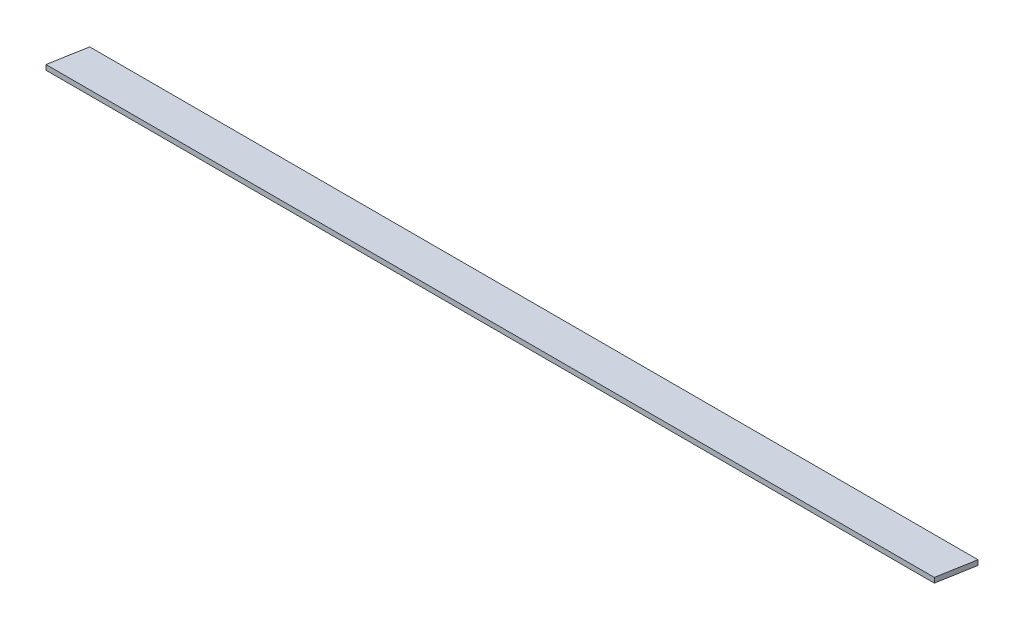
ISO-10303-21;
HEADER;
FILE_DESCRIPTION(('STEP AP214'),'2;1');
FILE_NAME('part.step','',(''),(''),'','','');
FILE_SCHEMA(('AUTOMOTIVE_DESIGN { 1 0 10303 214 1 1 1 1 }'));
ENDSEC;
DATA;
#1=APPLICATION_CONTEXT('core data for automotive mechanical design processes');
#2=APPLICATION_PROTOCOL_DEFINITION('international standard','automotive_design',2000,#1);
#3=PRODUCT_CONTEXT('',#1,'mechanical');
#4=PRODUCT('Part','Part','',(#3));
#5=PRODUCT_RELATED_PRODUCT_CATEGORY('part','',(#4));
#6=PRODUCT_DEFINITION_FORMATION('','',#4);
#7=PRODUCT_DEFINITION_CONTEXT('part definition',#1,'design');
#8=PRODUCT_DEFINITION('design','',#6,#7);
#9=PRODUCT_DEFINITION_SHAPE('','',#8);
#10=(LENGTH_UNIT() NAMED_UNIT(*) SI_UNIT(.MILLI.,.METRE.));
#11=(NAMED_UNIT(*) PLANE_ANGLE_UNIT() SI_UNIT($,.RADIAN.));
#12=(NAMED_UNIT(*) SI_UNIT($,.STERADIAN.) SOLID_ANGLE_UNIT());
#13=UNCERTAINTY_MEASURE_WITH_UNIT(LENGTH_MEASURE(1.E-05),#10,'distance_accuracy_value','');
#14=(GEOMETRIC_REPRESENTATION_CONTEXT(3) GLOBAL_UNCERTAINTY_ASSIGNED_CONTEXT((#13)) GLOBAL_UNIT_ASSIGNED_CONTEXT((#10,
#11,#12)) REPRESENTATION_CONTEXT('',''));
#15=CARTESIAN_POINT('',(0.,0.,0.));
#16=DIRECTION('',(0.,0.,1.));
#17=DIRECTION('',(1.,0.,0.));
#18=AXIS2_PLACEMENT_3D('',#15,#16,#17);
#19=CARTESIAN_POINT('',(-1143.,5.953125,-44.45));
#20=DIRECTION('',(0.,0.,1.));
#21=DIRECTION('',(1.,0.,0.));
#22=AXIS2_PLACEMENT_3D('',#19,#20,#21);
#23=PLANE('',#22);
#24=DIRECTION('',(-1.,0.,0.));
#25=VECTOR('',#24,1.);
#26=CARTESIAN_POINT('',(-1143.,-5.953125,-44.45));
#27=LINE('',#26,#25);
#28=CARTESIAN_POINT('',(1090.41296858498,-5.953125,-44.45));
#29=VERTEX_POINT('',#28);
#30=CARTESIAN_POINT('',(-1035.24953141502,-5.953125,-44.45));
#31=VERTEX_POINT('',#30);
#32=EDGE_CURVE('E97',#29,#31,#27,.T.);
#33=ORIENTED_EDGE('',*,*,#32,.T.);
#34=DIRECTION('',(0.,1.,0.));
#35=VECTOR('',#34,1.);
#36=CARTESIAN_POINT('',(-1035.24953141502,-5.953125,-44.45));
#37=LINE('',#36,#35);
#38=CARTESIAN_POINT('',(-1035.24953141502,5.953125,-44.45));
#39=VERTEX_POINT('',#38);
#40=EDGE_CURVE('E48',#31,#39,#37,.T.);
#41=ORIENTED_EDGE('',*,*,#40,.T.);
#42=DIRECTION('',(-1.,0.,0.));
#43=VECTOR('',#42,1.);
#44=CARTESIAN_POINT('',(-1143.,5.953125,-44.45));
#45=LINE('',#44,#43);
#46=CARTESIAN_POINT('',(1090.41296858498,5.953125,-44.45));
#47=VERTEX_POINT('',#46);
#48=EDGE_CURVE('E40',#47,#39,#45,.T.);
#49=ORIENTED_EDGE('',*,*,#48,.F.);
#50=DIRECTION('',(0.,1.,0.));
#51=VECTOR('',#50,1.);
#52=CARTESIAN_POINT('',(1090.41296858498,-5.953125,-44.45));
#53=LINE('',#52,#51);
#54=EDGE_CURVE('E89',#29,#47,#53,.T.);
#55=ORIENTED_EDGE('',*,*,#54,.F.);
#56=EDGE_LOOP('',(#33,#41,#49,#55));
#57=FACE_BOUND('',#56,.T.);
#58=ADVANCED_FACE('F32',(#57),#23,.F.);
#59=CARTESIAN_POINT('',(-1143.,5.953125,44.45));
#60=DIRECTION('',(0.,0.,-1.));
#61=DIRECTION('',(-1.,0.,0.));
#62=AXIS2_PLACEMENT_3D('',#59,#60,#61);
#63=PLANE('',#62);
#64=DIRECTION('',(1.,0.,0.));
#65=VECTOR('',#64,1.);
#66=CARTESIAN_POINT('',(-1143.,5.953125,44.45));
#67=LINE('',#66,#65);
#68=CARTESIAN_POINT('',(-1050.925,5.953125,44.45));
#69=VERTEX_POINT('',#68);
#70=CARTESIAN_POINT('',(1074.7375,5.953125,44.45));
#71=VERTEX_POINT('',#70);
#72=EDGE_CURVE('E11',#69,#71,#67,.T.);
#73=ORIENTED_EDGE('',*,*,#72,.F.);
#74=DIRECTION('',(0.,1.,0.));
#75=VECTOR('',#74,1.);
#76=CARTESIAN_POINT('',(-1050.925,-5.953125,44.45));
#77=LINE('',#76,#75);
#78=CARTESIAN_POINT('',(-1050.925,-5.953125,44.45));
#79=VERTEX_POINT('',#78);
#80=EDGE_CURVE('E72',#79,#69,#77,.T.);
#81=ORIENTED_EDGE('',*,*,#80,.F.);
#82=DIRECTION('',(1.,0.,0.));
#83=VECTOR('',#82,1.);
#84=CARTESIAN_POINT('',(-1143.,-5.953125,44.45));
#85=LINE('',#84,#83);
#86=CARTESIAN_POINT('',(1074.7375,-5.953125,44.45));
#87=VERTEX_POINT('',#86);
#88=EDGE_CURVE('E35',#79,#87,#85,.T.);
#89=ORIENTED_EDGE('',*,*,#88,.T.);
#90=DIRECTION('',(0.,1.,0.));
#91=VECTOR('',#90,1.);
#92=CARTESIAN_POINT('',(1074.7375,-5.953125,44.45));
#93=LINE('',#92,#91);
#94=EDGE_CURVE('E56',#87,#71,#93,.T.);
#95=ORIENTED_EDGE('',*,*,#94,.T.);
#96=EDGE_LOOP('',(#73,#81,#89,#95));
#97=FACE_BOUND('',#96,.T.);
#98=ADVANCED_FACE('F88',(#97),#63,.F.);
#99=CARTESIAN_POINT('',(0.,5.953125,0.));
#100=DIRECTION('',(0.,1.,0.));
#101=DIRECTION('',(0.,0.,1.));
#102=AXIS2_PLACEMENT_3D('',#99,#100,#101);
#103=PLANE('',#102);
#104=DIRECTION('',(0.173648177666937,0.,-0.984807753012207));
#105=VECTOR('',#104,1.);
#106=CARTESIAN_POINT('',(-1035.24953141502,5.953125,-44.45));
#107=LINE('',#106,#105);
#108=EDGE_CURVE('E75',#69,#39,#107,.T.);
#109=ORIENTED_EDGE('',*,*,#108,.F.);
#110=ORIENTED_EDGE('',*,*,#72,.T.);
#111=DIRECTION('',(-0.173648177666937,0.,0.984807753012207));
#112=VECTOR('',#111,1.);
#113=CARTESIAN_POINT('',(1090.41296858498,5.953125,-44.45));
#114=LINE('',#113,#112);
#115=EDGE_CURVE('E94',#47,#71,#114,.T.);
#116=ORIENTED_EDGE('',*,*,#115,.F.);
#117=ORIENTED_EDGE('',*,*,#48,.T.);
#118=EDGE_LOOP('',(#109,#110,#116,#117));
#119=FACE_BOUND('',#118,.T.);
#120=ADVANCED_FACE('F84',(#119),#103,.T.);
#121=CARTESIAN_POINT('',(0.,-5.953125,0.));
#122=DIRECTION('',(0.,1.,0.));
#123=DIRECTION('',(0.,0.,1.));
#124=AXIS2_PLACEMENT_3D('',#121,#122,#123);
#125=PLANE('',#124);
#126=ORIENTED_EDGE('',*,*,#88,.F.);
#127=DIRECTION('',(0.173648177666937,0.,-0.984807753012207));
#128=VECTOR('',#127,1.);
#129=CARTESIAN_POINT('',(-1035.24953141502,-5.953125,-44.45));
#130=LINE('',#129,#128);
#131=EDGE_CURVE('E76',#79,#31,#130,.T.);
#132=ORIENTED_EDGE('',*,*,#131,.T.);
#133=ORIENTED_EDGE('',*,*,#32,.F.);
#134=DIRECTION('',(-0.173648177666937,0.,0.984807753012207));
#135=VECTOR('',#134,1.);
#136=CARTESIAN_POINT('',(1090.41296858498,-5.953125,-44.45));
#137=LINE('',#136,#135);
#138=EDGE_CURVE('E91',#29,#87,#137,.T.);
#139=ORIENTED_EDGE('',*,*,#138,.T.);
#140=EDGE_LOOP('',(#126,#132,#133,#139));
#141=FACE_BOUND('',#140,.T.);
#142=ADVANCED_FACE('F106',(#141),#125,.F.);
#143=CARTESIAN_POINT('',(1090.41296858498,-5.953125,-44.45));
#144=DIRECTION('',(-0.984807753012207,0.,-0.173648177666937));
#145=DIRECTION('',(-0.173648177666937,0.,0.984807753012207));
#146=AXIS2_PLACEMENT_3D('',#143,#144,#145);
#147=PLANE('',#146);
#148=ORIENTED_EDGE('',*,*,#115,.T.);
#149=ORIENTED_EDGE('',*,*,#94,.F.);
#150=ORIENTED_EDGE('',*,*,#138,.F.);
#151=ORIENTED_EDGE('',*,*,#54,.T.);
#152=EDGE_LOOP('',(#148,#149,#150,#151));
#153=FACE_BOUND('',#152,.T.);
#154=ADVANCED_FACE('F105',(#153),#147,.F.);
#155=CARTESIAN_POINT('',(-1035.24953141502,-5.953125,-44.45));
#156=DIRECTION('',(0.984807753012207,0.,0.173648177666937));
#157=DIRECTION('',(0.173648177666937,0.,-0.984807753012207));
#158=AXIS2_PLACEMENT_3D('',#155,#156,#157);
#159=PLANE('',#158);
#160=ORIENTED_EDGE('',*,*,#108,.T.);
#161=ORIENTED_EDGE('',*,*,#40,.F.);
#162=ORIENTED_EDGE('',*,*,#131,.F.);
#163=ORIENTED_EDGE('',*,*,#80,.T.);
#164=EDGE_LOOP('',(#160,#161,#162,#163));
#165=FACE_BOUND('',#164,.T.);
#166=ADVANCED_FACE('F74',(#165),#159,.F.);
#167=CLOSED_SHELL('',(#58,#98,#120,#142,#154,#166));
#168=MANIFOLD_SOLID_BREP('B2',#167);
#169=ADVANCED_BREP_SHAPE_REPRESENTATION('',(#18,#168),#14);
#170=SHAPE_DEFINITION_REPRESENTATION(#9,#169);
ENDSEC;
END-ISO-10303-21;
